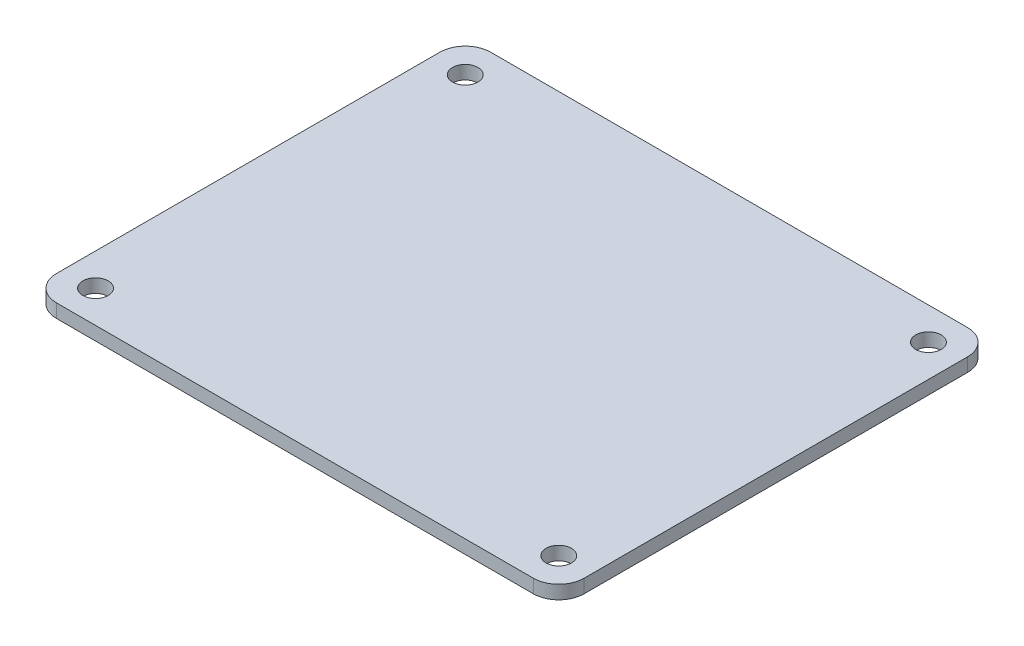
ISO-10303-21;
HEADER;
FILE_DESCRIPTION(('STEP AP214'),'2;1');
FILE_NAME('part.step','',(''),(''),'','','');
FILE_SCHEMA(('AUTOMOTIVE_DESIGN { 1 0 10303 214 1 1 1 1 }'));
ENDSEC;
DATA;
#1=APPLICATION_CONTEXT('core data for automotive mechanical design processes');
#2=APPLICATION_PROTOCOL_DEFINITION('international standard','automotive_design',2000,#1);
#3=PRODUCT_CONTEXT('',#1,'mechanical');
#4=PRODUCT('Part','Part','',(#3));
#5=PRODUCT_RELATED_PRODUCT_CATEGORY('part','',(#4));
#6=PRODUCT_DEFINITION_FORMATION('','',#4);
#7=PRODUCT_DEFINITION_CONTEXT('part definition',#1,'design');
#8=PRODUCT_DEFINITION('design','',#6,#7);
#9=PRODUCT_DEFINITION_SHAPE('','',#8);
#10=(LENGTH_UNIT() NAMED_UNIT(*) SI_UNIT(.MILLI.,.METRE.));
#11=(NAMED_UNIT(*) PLANE_ANGLE_UNIT() SI_UNIT($,.RADIAN.));
#12=(NAMED_UNIT(*) SI_UNIT($,.STERADIAN.) SOLID_ANGLE_UNIT());
#13=UNCERTAINTY_MEASURE_WITH_UNIT(LENGTH_MEASURE(1.E-05),#10,'distance_accuracy_value','');
#14=(GEOMETRIC_REPRESENTATION_CONTEXT(3) GLOBAL_UNCERTAINTY_ASSIGNED_CONTEXT((#13)) GLOBAL_UNIT_ASSIGNED_CONTEXT((#10,
#11,#12)) REPRESENTATION_CONTEXT('',''));
#15=CARTESIAN_POINT('',(0.,0.,0.));
#16=DIRECTION('',(0.,0.,1.));
#17=DIRECTION('',(1.,0.,0.));
#18=AXIS2_PLACEMENT_3D('',#15,#16,#17);
#19=CARTESIAN_POINT('',(-22.8573891178231,1.6,-20.0021461277019));
#20=DIRECTION('',(0.,-1.,0.));
#21=DIRECTION('',(0.,0.,-1.));
#22=AXIS2_PLACEMENT_3D('',#19,#20,#21);
#23=PLANE('',#22);
#24=CARTESIAN_POINT('',(-22.8573891178231,1.6,-20.0021461277019));
#25=DIRECTION('',(0.,1.,0.));
#26=DIRECTION('',(0.,0.,-1.));
#27=AXIS2_PLACEMENT_3D('',#24,#25,#26);
#28=CIRCLE('',#27,3.);
#29=CARTESIAN_POINT('',(-22.8573891178231,1.6,-23.0021461277019));
#30=VERTEX_POINT('',#29);
#31=CARTESIAN_POINT('',(-25.8573891178231,1.6,-20.0021461277019));
#32=VERTEX_POINT('',#31);
#33=EDGE_CURVE('E152',#30,#32,#28,.T.);
#34=ORIENTED_EDGE('',*,*,#33,.T.);
#35=DIRECTION('',(0.,0.,1.));
#36=VECTOR('',#35,1.);
#37=CARTESIAN_POINT('',(-25.8573891178231,1.6,-20.0021461277019));
#38=LINE('',#37,#36);
#39=CARTESIAN_POINT('',(-25.8573891178231,1.6,25.3078538722981));
#40=VERTEX_POINT('',#39);
#41=EDGE_CURVE('E100',#32,#40,#38,.T.);
#42=ORIENTED_EDGE('',*,*,#41,.T.);
#43=CARTESIAN_POINT('',(-22.8573891178231,1.6,25.3078538722981));
#44=DIRECTION('',(0.,1.,0.));
#45=DIRECTION('',(0.,0.,1.));
#46=AXIS2_PLACEMENT_3D('',#43,#44,#45);
#47=CIRCLE('',#46,3.);
#48=CARTESIAN_POINT('',(-22.8573891178231,1.6,28.3078538722981));
#49=VERTEX_POINT('',#48);
#50=EDGE_CURVE('E167',#40,#49,#47,.T.);
#51=ORIENTED_EDGE('',*,*,#50,.T.);
#52=DIRECTION('',(1.,0.,0.));
#53=VECTOR('',#52,1.);
#54=CARTESIAN_POINT('',(-22.8573891178231,1.6,28.3078538722981));
#55=LINE('',#54,#53);
#56=CARTESIAN_POINT('',(33.5026108821769,1.6,28.3078538722981));
#57=VERTEX_POINT('',#56);
#58=EDGE_CURVE('E180',#49,#57,#55,.T.);
#59=ORIENTED_EDGE('',*,*,#58,.T.);
#60=CARTESIAN_POINT('',(33.5026108821769,1.6,25.3078538722981));
#61=DIRECTION('',(0.,1.,0.));
#62=DIRECTION('',(0.,0.,1.));
#63=AXIS2_PLACEMENT_3D('',#60,#61,#62);
#64=CIRCLE('',#63,3.);
#65=CARTESIAN_POINT('',(36.5026108821769,1.6,25.3078538722981));
#66=VERTEX_POINT('',#65);
#67=EDGE_CURVE('E119',#57,#66,#64,.T.);
#68=ORIENTED_EDGE('',*,*,#67,.T.);
#69=DIRECTION('',(0.,0.,-1.));
#70=VECTOR('',#69,1.);
#71=CARTESIAN_POINT('',(36.5026108821769,1.6,-20.0021461277019));
#72=LINE('',#71,#70);
#73=CARTESIAN_POINT('',(36.5026108821769,1.6,-20.0021461277019));
#74=VERTEX_POINT('',#73);
#75=EDGE_CURVE('E113',#66,#74,#72,.T.);
#76=ORIENTED_EDGE('',*,*,#75,.T.);
#77=CARTESIAN_POINT('',(33.5026108821769,1.6,-20.0021461277019));
#78=DIRECTION('',(0.,1.,0.));
#79=DIRECTION('',(0.,0.,1.));
#80=AXIS2_PLACEMENT_3D('',#77,#78,#79);
#81=CIRCLE('',#80,3.);
#82=CARTESIAN_POINT('',(33.5026108821769,1.6,-23.0021461277019));
#83=VERTEX_POINT('',#82);
#84=EDGE_CURVE('E117',#74,#83,#81,.T.);
#85=ORIENTED_EDGE('',*,*,#84,.T.);
#86=DIRECTION('',(-1.,0.,0.));
#87=VECTOR('',#86,1.);
#88=CARTESIAN_POINT('',(-22.8573891178231,1.6,-23.0021461277019));
#89=LINE('',#88,#87);
#90=EDGE_CURVE('E57',#83,#30,#89,.T.);
#91=ORIENTED_EDGE('',*,*,#90,.T.);
#92=EDGE_LOOP('',(#34,#42,#51,#59,#68,#76,#85,#91));
#93=FACE_BOUND('',#92,.T.);
#94=CARTESIAN_POINT('',(-22.0473891178231,1.6,-19.1921461277019));
#95=DIRECTION('',(0.,1.,0.));
#96=DIRECTION('',(0.,0.,1.));
#97=AXIS2_PLACEMENT_3D('',#94,#95,#96);
#98=CIRCLE('',#97,1.5);
#99=CARTESIAN_POINT('',(-22.0473891178231,1.6,-17.6921461277019));
#100=VERTEX_POINT('',#99);
#101=EDGE_CURVE('E141',#100,#100,#98,.T.);
#102=ORIENTED_EDGE('',*,*,#101,.F.);
#103=EDGE_LOOP('',(#102));
#104=FACE_BOUND('',#103,.T.);
#105=CARTESIAN_POINT('',(32.6926108821769,1.6,-19.1921461277019));
#106=DIRECTION('',(0.,1.,0.));
#107=DIRECTION('',(0.,0.,1.));
#108=AXIS2_PLACEMENT_3D('',#105,#106,#107);
#109=CIRCLE('',#108,1.5);
#110=CARTESIAN_POINT('',(32.6926108821769,1.6,-17.6921461277019));
#111=VERTEX_POINT('',#110);
#112=EDGE_CURVE('E189',#111,#111,#109,.T.);
#113=ORIENTED_EDGE('',*,*,#112,.F.);
#114=EDGE_LOOP('',(#113));
#115=FACE_BOUND('',#114,.T.);
#116=CARTESIAN_POINT('',(-22.0473891178231,1.6,24.4978538722981));
#117=DIRECTION('',(0.,1.,0.));
#118=DIRECTION('',(0.,0.,1.));
#119=AXIS2_PLACEMENT_3D('',#116,#117,#118);
#120=CIRCLE('',#119,1.5);
#121=CARTESIAN_POINT('',(-22.0473891178231,1.6,25.9978538722981));
#122=VERTEX_POINT('',#121);
#123=EDGE_CURVE('E195',#122,#122,#120,.T.);
#124=ORIENTED_EDGE('',*,*,#123,.F.);
#125=EDGE_LOOP('',(#124));
#126=FACE_BOUND('',#125,.T.);
#127=CARTESIAN_POINT('',(32.6926108821769,1.6,24.4978538722981));
#128=DIRECTION('',(0.,1.,0.));
#129=DIRECTION('',(0.,0.,1.));
#130=AXIS2_PLACEMENT_3D('',#127,#128,#129);
#131=CIRCLE('',#130,1.5);
#132=CARTESIAN_POINT('',(32.6926108821769,1.6,25.9978538722981));
#133=VERTEX_POINT('',#132);
#134=EDGE_CURVE('E201',#133,#133,#131,.T.);
#135=ORIENTED_EDGE('',*,*,#134,.F.);
#136=EDGE_LOOP('',(#135));
#137=FACE_BOUND('',#136,.T.);
#138=ADVANCED_FACE('F40',(#93,#104,#115,#126,#137),#23,.F.);
#139=CARTESIAN_POINT('',(-22.8573891178231,0.,-20.0021461277019));
#140=DIRECTION('',(0.,-1.,0.));
#141=DIRECTION('',(0.,0.,-1.));
#142=AXIS2_PLACEMENT_3D('',#139,#140,#141);
#143=PLANE('',#142);
#144=CARTESIAN_POINT('',(-22.0473891178231,0.,24.4978538722981));
#145=DIRECTION('',(0.,1.,0.));
#146=DIRECTION('',(0.,0.,1.));
#147=AXIS2_PLACEMENT_3D('',#144,#145,#146);
#148=CIRCLE('',#147,1.5);
#149=CARTESIAN_POINT('',(-22.0473891178231,0.,25.9978538722981));
#150=VERTEX_POINT('',#149);
#151=EDGE_CURVE('E198',#150,#150,#148,.T.);
#152=ORIENTED_EDGE('',*,*,#151,.T.);
#153=EDGE_LOOP('',(#152));
#154=FACE_BOUND('',#153,.T.);
#155=CARTESIAN_POINT('',(-22.0473891178231,0.,-19.1921461277019));
#156=DIRECTION('',(0.,1.,0.));
#157=DIRECTION('',(0.,0.,1.));
#158=AXIS2_PLACEMENT_3D('',#155,#156,#157);
#159=CIRCLE('',#158,1.5);
#160=CARTESIAN_POINT('',(-22.0473891178231,0.,-17.6921461277019));
#161=VERTEX_POINT('',#160);
#162=EDGE_CURVE('E186',#161,#161,#159,.T.);
#163=ORIENTED_EDGE('',*,*,#162,.T.);
#164=EDGE_LOOP('',(#163));
#165=FACE_BOUND('',#164,.T.);
#166=CARTESIAN_POINT('',(-22.8573891178231,0.,-20.0021461277019));
#167=DIRECTION('',(0.,1.,0.));
#168=DIRECTION('',(0.,0.,-1.));
#169=AXIS2_PLACEMENT_3D('',#166,#167,#168);
#170=CIRCLE('',#169,3.);
#171=CARTESIAN_POINT('',(-22.8573891178231,0.,-23.0021461277019));
#172=VERTEX_POINT('',#171);
#173=CARTESIAN_POINT('',(-25.8573891178231,0.,-20.0021461277019));
#174=VERTEX_POINT('',#173);
#175=EDGE_CURVE('E137',#172,#174,#170,.T.);
#176=ORIENTED_EDGE('',*,*,#175,.F.);
#177=DIRECTION('',(-1.,0.,0.));
#178=VECTOR('',#177,1.);
#179=CARTESIAN_POINT('',(-22.8573891178231,0.,-23.0021461277019));
#180=LINE('',#179,#178);
#181=CARTESIAN_POINT('',(33.5026108821769,0.,-23.0021461277019));
#182=VERTEX_POINT('',#181);
#183=EDGE_CURVE('E92',#182,#172,#180,.T.);
#184=ORIENTED_EDGE('',*,*,#183,.F.);
#185=CARTESIAN_POINT('',(33.5026108821769,0.,-20.0021461277019));
#186=DIRECTION('',(0.,1.,0.));
#187=DIRECTION('',(0.,0.,1.));
#188=AXIS2_PLACEMENT_3D('',#185,#186,#187);
#189=CIRCLE('',#188,3.);
#190=CARTESIAN_POINT('',(36.5026108821769,0.,-20.0021461277019));
#191=VERTEX_POINT('',#190);
#192=EDGE_CURVE('E86',#191,#182,#189,.T.);
#193=ORIENTED_EDGE('',*,*,#192,.F.);
#194=DIRECTION('',(0.,0.,-1.));
#195=VECTOR('',#194,1.);
#196=CARTESIAN_POINT('',(36.5026108821769,0.,-20.0021461277019));
#197=LINE('',#196,#195);
#198=CARTESIAN_POINT('',(36.5026108821769,0.,25.3078538722981));
#199=VERTEX_POINT('',#198);
#200=EDGE_CURVE('E127',#199,#191,#197,.T.);
#201=ORIENTED_EDGE('',*,*,#200,.F.);
#202=CARTESIAN_POINT('',(33.5026108821769,0.,25.3078538722981));
#203=DIRECTION('',(0.,1.,0.));
#204=DIRECTION('',(0.,0.,1.));
#205=AXIS2_PLACEMENT_3D('',#202,#203,#204);
#206=CIRCLE('',#205,3.);
#207=CARTESIAN_POINT('',(33.5026108821769,0.,28.3078538722981));
#208=VERTEX_POINT('',#207);
#209=EDGE_CURVE('E147',#208,#199,#206,.T.);
#210=ORIENTED_EDGE('',*,*,#209,.F.);
#211=DIRECTION('',(1.,0.,0.));
#212=VECTOR('',#211,1.);
#213=CARTESIAN_POINT('',(-22.8573891178231,0.,28.3078538722981));
#214=LINE('',#213,#212);
#215=CARTESIAN_POINT('',(-22.8573891178231,0.,28.3078538722981));
#216=VERTEX_POINT('',#215);
#217=EDGE_CURVE('E145',#216,#208,#214,.T.);
#218=ORIENTED_EDGE('',*,*,#217,.F.);
#219=CARTESIAN_POINT('',(-22.8573891178231,0.,25.3078538722981));
#220=DIRECTION('',(0.,1.,0.));
#221=DIRECTION('',(0.,0.,1.));
#222=AXIS2_PLACEMENT_3D('',#219,#220,#221);
#223=CIRCLE('',#222,3.);
#224=CARTESIAN_POINT('',(-25.8573891178231,0.,25.3078538722981));
#225=VERTEX_POINT('',#224);
#226=EDGE_CURVE('E143',#225,#216,#223,.T.);
#227=ORIENTED_EDGE('',*,*,#226,.F.);
#228=DIRECTION('',(0.,0.,1.));
#229=VECTOR('',#228,1.);
#230=CARTESIAN_POINT('',(-25.8573891178231,0.,-20.0021461277019));
#231=LINE('',#230,#229);
#232=EDGE_CURVE('E140',#174,#225,#231,.T.);
#233=ORIENTED_EDGE('',*,*,#232,.F.);
#234=EDGE_LOOP('',(#176,#184,#193,#201,#210,#218,#227,#233));
#235=FACE_BOUND('',#234,.T.);
#236=CARTESIAN_POINT('',(32.6926108821769,0.,-19.1921461277019));
#237=DIRECTION('',(0.,1.,0.));
#238=DIRECTION('',(0.,0.,1.));
#239=AXIS2_PLACEMENT_3D('',#236,#237,#238);
#240=CIRCLE('',#239,1.5);
#241=CARTESIAN_POINT('',(32.6926108821769,0.,-17.6921461277019));
#242=VERTEX_POINT('',#241);
#243=EDGE_CURVE('E192',#242,#242,#240,.T.);
#244=ORIENTED_EDGE('',*,*,#243,.T.);
#245=EDGE_LOOP('',(#244));
#246=FACE_BOUND('',#245,.T.);
#247=CARTESIAN_POINT('',(32.6926108821769,0.,24.4978538722981));
#248=DIRECTION('',(0.,1.,0.));
#249=DIRECTION('',(0.,0.,1.));
#250=AXIS2_PLACEMENT_3D('',#247,#248,#249);
#251=CIRCLE('',#250,1.5);
#252=CARTESIAN_POINT('',(32.6926108821769,0.,25.9978538722981));
#253=VERTEX_POINT('',#252);
#254=EDGE_CURVE('E204',#253,#253,#251,.T.);
#255=ORIENTED_EDGE('',*,*,#254,.T.);
#256=EDGE_LOOP('',(#255));
#257=FACE_BOUND('',#256,.T.);
#258=ADVANCED_FACE('F171',(#154,#165,#235,#246,#257),#143,.T.);
#259=CARTESIAN_POINT('',(-22.8573891178231,1.6,-20.0021461277019));
#260=DIRECTION('',(0.,-1.,0.));
#261=DIRECTION('',(0.,0.,-1.));
#262=AXIS2_PLACEMENT_3D('',#259,#260,#261);
#263=CYLINDRICAL_SURFACE('',#262,3.);
#264=ORIENTED_EDGE('',*,*,#175,.T.);
#265=DIRECTION('',(0.,-1.,0.));
#266=VECTOR('',#265,1.);
#267=CARTESIAN_POINT('',(-25.8573891178231,1.6,-20.0021461277019));
#268=LINE('',#267,#266);
#269=EDGE_CURVE('E11',#32,#174,#268,.T.);
#270=ORIENTED_EDGE('',*,*,#269,.F.);
#271=ORIENTED_EDGE('',*,*,#33,.F.);
#272=DIRECTION('',(0.,-1.,0.));
#273=VECTOR('',#272,1.);
#274=CARTESIAN_POINT('',(-22.8573891178231,1.6,-23.0021461277019));
#275=LINE('',#274,#273);
#276=EDGE_CURVE('E133',#30,#172,#275,.T.);
#277=ORIENTED_EDGE('',*,*,#276,.T.);
#278=EDGE_LOOP('',(#264,#270,#271,#277));
#279=FACE_BOUND('',#278,.T.);
#280=ADVANCED_FACE('F42',(#279),#263,.T.);
#281=CARTESIAN_POINT('',(-25.8573891178231,1.6,-20.0021461277019));
#282=DIRECTION('',(1.,0.,0.));
#283=DIRECTION('',(0.,0.,-1.));
#284=AXIS2_PLACEMENT_3D('',#281,#282,#283);
#285=PLANE('',#284);
#286=ORIENTED_EDGE('',*,*,#232,.T.);
#287=DIRECTION('',(0.,-1.,0.));
#288=VECTOR('',#287,1.);
#289=CARTESIAN_POINT('',(-25.8573891178231,1.6,25.3078538722981));
#290=LINE('',#289,#288);
#291=EDGE_CURVE('E49',#40,#225,#290,.T.);
#292=ORIENTED_EDGE('',*,*,#291,.F.);
#293=ORIENTED_EDGE('',*,*,#41,.F.);
#294=ORIENTED_EDGE('',*,*,#269,.T.);
#295=EDGE_LOOP('',(#286,#292,#293,#294));
#296=FACE_BOUND('',#295,.T.);
#297=ADVANCED_FACE('F236',(#296),#285,.F.);
#298=CARTESIAN_POINT('',(-22.8573891178231,1.6,25.3078538722981));
#299=DIRECTION('',(0.,-1.,0.));
#300=DIRECTION('',(0.,0.,-1.));
#301=AXIS2_PLACEMENT_3D('',#298,#299,#300);
#302=CYLINDRICAL_SURFACE('',#301,3.);
#303=ORIENTED_EDGE('',*,*,#226,.T.);
#304=DIRECTION('',(0.,-1.,0.));
#305=VECTOR('',#304,1.);
#306=CARTESIAN_POINT('',(-22.8573891178231,1.6,28.3078538722981));
#307=LINE('',#306,#305);
#308=EDGE_CURVE('E159',#49,#216,#307,.T.);
#309=ORIENTED_EDGE('',*,*,#308,.F.);
#310=ORIENTED_EDGE('',*,*,#50,.F.);
#311=ORIENTED_EDGE('',*,*,#291,.T.);
#312=EDGE_LOOP('',(#303,#309,#310,#311));
#313=FACE_BOUND('',#312,.T.);
#314=ADVANCED_FACE('F165',(#313),#302,.T.);
#315=CARTESIAN_POINT('',(-22.8573891178231,1.6,28.3078538722981));
#316=DIRECTION('',(0.,0.,-1.));
#317=DIRECTION('',(-1.,0.,0.));
#318=AXIS2_PLACEMENT_3D('',#315,#316,#317);
#319=PLANE('',#318);
#320=ORIENTED_EDGE('',*,*,#217,.T.);
#321=DIRECTION('',(0.,-1.,0.));
#322=VECTOR('',#321,1.);
#323=CARTESIAN_POINT('',(33.5026108821769,1.6,28.3078538722981));
#324=LINE('',#323,#322);
#325=EDGE_CURVE('E156',#57,#208,#324,.T.);
#326=ORIENTED_EDGE('',*,*,#325,.F.);
#327=ORIENTED_EDGE('',*,*,#58,.F.);
#328=ORIENTED_EDGE('',*,*,#308,.T.);
#329=EDGE_LOOP('',(#320,#326,#327,#328));
#330=FACE_BOUND('',#329,.T.);
#331=ADVANCED_FACE('F176',(#330),#319,.F.);
#332=CARTESIAN_POINT('',(33.5026108821769,1.6,25.3078538722981));
#333=DIRECTION('',(0.,-1.,0.));
#334=DIRECTION('',(0.,0.,-1.));
#335=AXIS2_PLACEMENT_3D('',#332,#333,#334);
#336=CYLINDRICAL_SURFACE('',#335,3.);
#337=ORIENTED_EDGE('',*,*,#209,.T.);
#338=DIRECTION('',(0.,-1.,0.));
#339=VECTOR('',#338,1.);
#340=CARTESIAN_POINT('',(36.5026108821769,1.6,25.3078538722981));
#341=LINE('',#340,#339);
#342=EDGE_CURVE('E128',#66,#199,#341,.T.);
#343=ORIENTED_EDGE('',*,*,#342,.F.);
#344=ORIENTED_EDGE('',*,*,#67,.F.);
#345=ORIENTED_EDGE('',*,*,#325,.T.);
#346=EDGE_LOOP('',(#337,#343,#344,#345));
#347=FACE_BOUND('',#346,.T.);
#348=ADVANCED_FACE('F179',(#347),#336,.T.);
#349=CARTESIAN_POINT('',(36.5026108821769,1.6,-20.0021461277019));
#350=DIRECTION('',(-1.,0.,0.));
#351=DIRECTION('',(0.,0.,1.));
#352=AXIS2_PLACEMENT_3D('',#349,#350,#351);
#353=PLANE('',#352);
#354=ORIENTED_EDGE('',*,*,#200,.T.);
#355=DIRECTION('',(0.,-1.,0.));
#356=VECTOR('',#355,1.);
#357=CARTESIAN_POINT('',(36.5026108821769,1.6,-20.0021461277019));
#358=LINE('',#357,#356);
#359=EDGE_CURVE('E124',#74,#191,#358,.T.);
#360=ORIENTED_EDGE('',*,*,#359,.F.);
#361=ORIENTED_EDGE('',*,*,#75,.F.);
#362=ORIENTED_EDGE('',*,*,#342,.T.);
#363=EDGE_LOOP('',(#354,#360,#361,#362));
#364=FACE_BOUND('',#363,.T.);
#365=ADVANCED_FACE('F125',(#364),#353,.F.);
#366=CARTESIAN_POINT('',(33.5026108821769,1.6,-20.0021461277019));
#367=DIRECTION('',(0.,-1.,0.));
#368=DIRECTION('',(0.,0.,-1.));
#369=AXIS2_PLACEMENT_3D('',#366,#367,#368);
#370=CYLINDRICAL_SURFACE('',#369,3.);
#371=ORIENTED_EDGE('',*,*,#192,.T.);
#372=DIRECTION('',(0.,-1.,0.));
#373=VECTOR('',#372,1.);
#374=CARTESIAN_POINT('',(33.5026108821769,1.6,-23.0021461277019));
#375=LINE('',#374,#373);
#376=EDGE_CURVE('E129',#83,#182,#375,.T.);
#377=ORIENTED_EDGE('',*,*,#376,.F.);
#378=ORIENTED_EDGE('',*,*,#84,.F.);
#379=ORIENTED_EDGE('',*,*,#359,.T.);
#380=EDGE_LOOP('',(#371,#377,#378,#379));
#381=FACE_BOUND('',#380,.T.);
#382=ADVANCED_FACE('F131',(#381),#370,.T.);
#383=CARTESIAN_POINT('',(-22.8573891178231,1.6,-23.0021461277019));
#384=DIRECTION('',(0.,0.,1.));
#385=DIRECTION('',(1.,0.,0.));
#386=AXIS2_PLACEMENT_3D('',#383,#384,#385);
#387=PLANE('',#386);
#388=ORIENTED_EDGE('',*,*,#183,.T.);
#389=ORIENTED_EDGE('',*,*,#276,.F.);
#390=ORIENTED_EDGE('',*,*,#90,.F.);
#391=ORIENTED_EDGE('',*,*,#376,.T.);
#392=EDGE_LOOP('',(#388,#389,#390,#391));
#393=FACE_BOUND('',#392,.T.);
#394=ADVANCED_FACE('F224',(#393),#387,.F.);
#395=CARTESIAN_POINT('',(-22.0473891178231,1.6,-19.1921461277019));
#396=DIRECTION('',(0.,-1.,0.));
#397=DIRECTION('',(0.,0.,-1.));
#398=AXIS2_PLACEMENT_3D('',#395,#396,#397);
#399=CYLINDRICAL_SURFACE('',#398,1.5);
#400=ORIENTED_EDGE('',*,*,#101,.T.);
#401=EDGE_LOOP('',(#400));
#402=FACE_BOUND('',#401,.T.);
#403=ORIENTED_EDGE('',*,*,#162,.F.);
#404=EDGE_LOOP('',(#403));
#405=FACE_BOUND('',#404,.T.);
#406=ADVANCED_FACE('F221',(#402,#405),#399,.F.);
#407=CARTESIAN_POINT('',(32.6926108821769,1.6,-19.1921461277019));
#408=DIRECTION('',(0.,-1.,0.));
#409=DIRECTION('',(0.,0.,-1.));
#410=AXIS2_PLACEMENT_3D('',#407,#408,#409);
#411=CYLINDRICAL_SURFACE('',#410,1.5);
#412=ORIENTED_EDGE('',*,*,#112,.T.);
#413=EDGE_LOOP('',(#412));
#414=FACE_BOUND('',#413,.T.);
#415=ORIENTED_EDGE('',*,*,#243,.F.);
#416=EDGE_LOOP('',(#415));
#417=FACE_BOUND('',#416,.T.);
#418=ADVANCED_FACE('F312',(#414,#417),#411,.F.);
#419=CARTESIAN_POINT('',(-22.0473891178231,1.6,24.4978538722981));
#420=DIRECTION('',(0.,-1.,0.));
#421=DIRECTION('',(0.,0.,-1.));
#422=AXIS2_PLACEMENT_3D('',#419,#420,#421);
#423=CYLINDRICAL_SURFACE('',#422,1.5);
#424=ORIENTED_EDGE('',*,*,#123,.T.);
#425=EDGE_LOOP('',(#424));
#426=FACE_BOUND('',#425,.T.);
#427=ORIENTED_EDGE('',*,*,#151,.F.);
#428=EDGE_LOOP('',(#427));
#429=FACE_BOUND('',#428,.T.);
#430=ADVANCED_FACE('F321',(#426,#429),#423,.F.);
#431=CARTESIAN_POINT('',(32.6926108821769,1.6,24.4978538722981));
#432=DIRECTION('',(0.,-1.,0.));
#433=DIRECTION('',(0.,0.,-1.));
#434=AXIS2_PLACEMENT_3D('',#431,#432,#433);
#435=CYLINDRICAL_SURFACE('',#434,1.5);
#436=ORIENTED_EDGE('',*,*,#134,.T.);
#437=EDGE_LOOP('',(#436));
#438=FACE_BOUND('',#437,.T.);
#439=ORIENTED_EDGE('',*,*,#254,.F.);
#440=EDGE_LOOP('',(#439));
#441=FACE_BOUND('',#440,.T.);
#442=ADVANCED_FACE('F210',(#438,#441),#435,.F.);
#443=CLOSED_SHELL('',(#138,#258,#280,#297,#314,#331,#348,#365,#382,#394,#406,#418,#430,#442));
#444=MANIFOLD_SOLID_BREP('B2',#443);
#445=ADVANCED_BREP_SHAPE_REPRESENTATION('',(#18,#444),#14);
#446=SHAPE_DEFINITION_REPRESENTATION(#9,#445);
ENDSEC;
END-ISO-10303-21;
